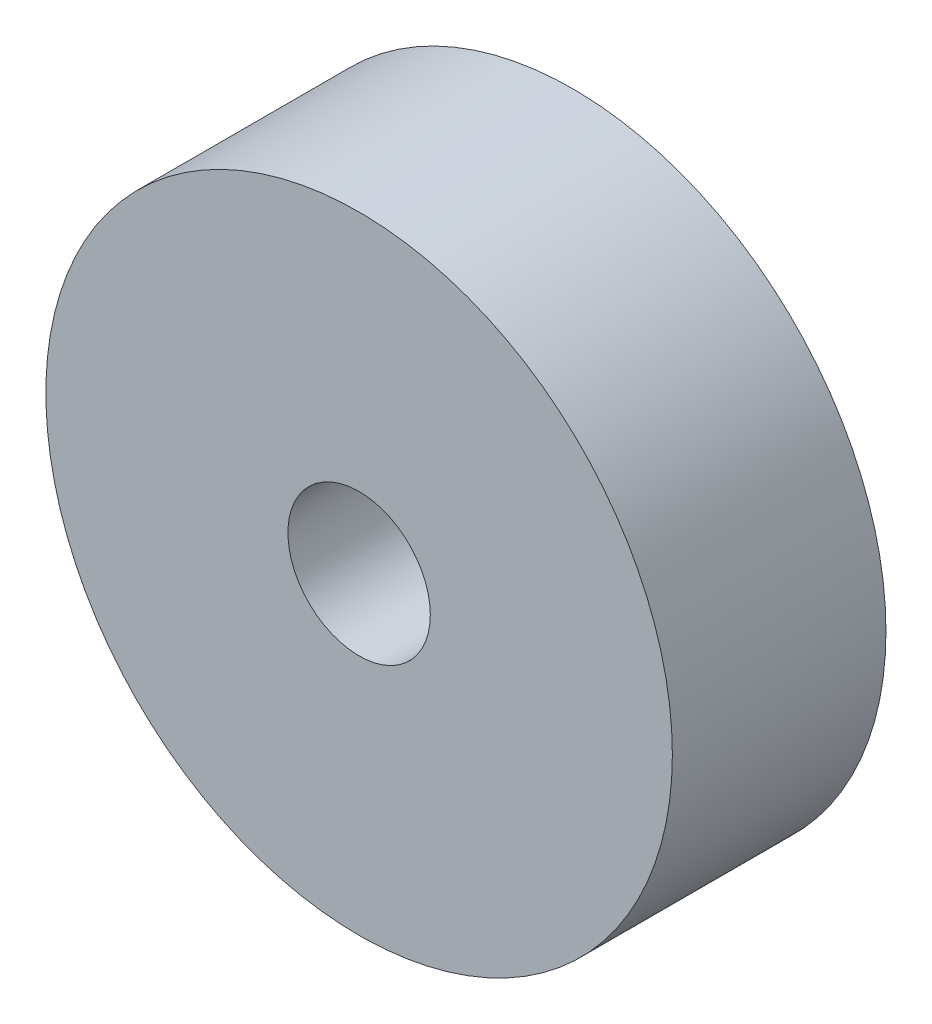
ISO-10303-21;
HEADER;
FILE_DESCRIPTION(('STEP AP214'),'2;1');
FILE_NAME('part.step','',(''),(''),'','','');
FILE_SCHEMA(('AUTOMOTIVE_DESIGN { 1 0 10303 214 1 1 1 1 }'));
ENDSEC;
DATA;
#1=APPLICATION_CONTEXT('core data for automotive mechanical design processes');
#2=APPLICATION_PROTOCOL_DEFINITION('international standard','automotive_design',2000,#1);
#3=PRODUCT_CONTEXT('',#1,'mechanical');
#4=PRODUCT('Part','Part','',(#3));
#5=PRODUCT_RELATED_PRODUCT_CATEGORY('part','',(#4));
#6=PRODUCT_DEFINITION_FORMATION('','',#4);
#7=PRODUCT_DEFINITION_CONTEXT('part definition',#1,'design');
#8=PRODUCT_DEFINITION('design','',#6,#7);
#9=PRODUCT_DEFINITION_SHAPE('','',#8);
#10=(LENGTH_UNIT() NAMED_UNIT(*) SI_UNIT(.MILLI.,.METRE.));
#11=(NAMED_UNIT(*) PLANE_ANGLE_UNIT() SI_UNIT($,.RADIAN.));
#12=(NAMED_UNIT(*) SI_UNIT($,.STERADIAN.) SOLID_ANGLE_UNIT());
#13=UNCERTAINTY_MEASURE_WITH_UNIT(LENGTH_MEASURE(1.E-05),#10,'distance_accuracy_value','');
#14=(GEOMETRIC_REPRESENTATION_CONTEXT(3) GLOBAL_UNCERTAINTY_ASSIGNED_CONTEXT((#13)) GLOBAL_UNIT_ASSIGNED_CONTEXT((#10,
#11,#12)) REPRESENTATION_CONTEXT('',''));
#15=CARTESIAN_POINT('',(0.,0.,0.));
#16=DIRECTION('',(0.,0.,1.));
#17=DIRECTION('',(1.,0.,0.));
#18=AXIS2_PLACEMENT_3D('',#15,#16,#17);
#19=CARTESIAN_POINT('',(0.,0.,15.));
#20=DIRECTION('',(0.,0.,1.));
#21=DIRECTION('',(1.,0.,0.));
#22=AXIS2_PLACEMENT_3D('',#19,#20,#21);
#23=PLANE('',#22);
#24=CARTESIAN_POINT('',(0.,0.,15.));
#25=DIRECTION('',(0.,0.,1.));
#26=DIRECTION('',(1.,0.,0.));
#27=AXIS2_PLACEMENT_3D('',#24,#25,#26);
#28=CIRCLE('',#27,5.);
#29=CARTESIAN_POINT('',(5.,0.,15.));
#30=VERTEX_POINT('',#29);
#31=EDGE_CURVE('E10',#30,#30,#28,.T.);
#32=ORIENTED_EDGE('',*,*,#31,.F.);
#33=EDGE_LOOP('',(#32));
#34=FACE_BOUND('',#33,.T.);
#35=CARTESIAN_POINT('',(0.,0.,15.));
#36=DIRECTION('',(0.,0.,1.));
#37=DIRECTION('',(1.,0.,0.));
#38=AXIS2_PLACEMENT_3D('',#35,#36,#37);
#39=CIRCLE('',#38,22.);
#40=CARTESIAN_POINT('',(22.,0.,15.));
#41=VERTEX_POINT('',#40);
#42=EDGE_CURVE('E41',#41,#41,#39,.T.);
#43=ORIENTED_EDGE('',*,*,#42,.T.);
#44=EDGE_LOOP('',(#43));
#45=FACE_BOUND('',#44,.T.);
#46=ADVANCED_FACE('F16',(#34,#45),#23,.T.);
#47=CARTESIAN_POINT('',(0.,0.,0.));
#48=DIRECTION('',(0.,0.,-1.));
#49=DIRECTION('',(1.,0.,0.));
#50=AXIS2_PLACEMENT_3D('',#47,#48,#49);
#51=CYLINDRICAL_SURFACE('',#50,5.);
#52=CARTESIAN_POINT('',(0.,0.,0.));
#53=DIRECTION('',(0.,0.,1.));
#54=DIRECTION('',(1.,0.,0.));
#55=AXIS2_PLACEMENT_3D('',#52,#53,#54);
#56=CIRCLE('',#55,5.);
#57=CARTESIAN_POINT('',(5.,0.,0.));
#58=VERTEX_POINT('',#57);
#59=EDGE_CURVE('E57',#58,#58,#56,.T.);
#60=ORIENTED_EDGE('',*,*,#59,.F.);
#61=DIRECTION('',(0.,0.,1.));
#62=VECTOR('',#61,1.);
#63=CARTESIAN_POINT('',(5.,0.,0.));
#64=LINE('',#63,#62);
#65=EDGE_CURVE('E24',#58,#30,#64,.T.);
#66=ORIENTED_EDGE('',*,*,#65,.T.);
#67=ORIENTED_EDGE('',*,*,#31,.T.);
#68=ORIENTED_EDGE('',*,*,#65,.F.);
#69=EDGE_LOOP('',(#60,#66,#67,#68));
#70=FACE_BOUND('',#69,.T.);
#71=ADVANCED_FACE('F70',(#70),#51,.F.);
#72=CARTESIAN_POINT('',(0.,0.,0.));
#73=DIRECTION('',(0.,0.,1.));
#74=DIRECTION('',(1.,0.,0.));
#75=AXIS2_PLACEMENT_3D('',#72,#73,#74);
#76=CYLINDRICAL_SURFACE('',#75,22.);
#77=CARTESIAN_POINT('',(0.,0.,0.));
#78=DIRECTION('',(0.,0.,1.));
#79=DIRECTION('',(1.,0.,0.));
#80=AXIS2_PLACEMENT_3D('',#77,#78,#79);
#81=CIRCLE('',#80,22.);
#82=CARTESIAN_POINT('',(22.,0.,0.));
#83=VERTEX_POINT('',#82);
#84=EDGE_CURVE('E55',#83,#83,#81,.T.);
#85=ORIENTED_EDGE('',*,*,#84,.T.);
#86=DIRECTION('',(0.,0.,1.));
#87=VECTOR('',#86,1.);
#88=CARTESIAN_POINT('',(22.,0.,0.));
#89=LINE('',#88,#87);
#90=EDGE_CURVE('E52',#83,#41,#89,.T.);
#91=ORIENTED_EDGE('',*,*,#90,.T.);
#92=ORIENTED_EDGE('',*,*,#42,.F.);
#93=ORIENTED_EDGE('',*,*,#90,.F.);
#94=EDGE_LOOP('',(#85,#91,#92,#93));
#95=FACE_BOUND('',#94,.T.);
#96=ADVANCED_FACE('F53',(#95),#76,.T.);
#97=CARTESIAN_POINT('',(0.,0.,0.));
#98=DIRECTION('',(0.,0.,1.));
#99=DIRECTION('',(1.,0.,0.));
#100=AXIS2_PLACEMENT_3D('',#97,#98,#99);
#101=PLANE('',#100);
#102=ORIENTED_EDGE('',*,*,#59,.T.);
#103=EDGE_LOOP('',(#102));
#104=FACE_BOUND('',#103,.T.);
#105=ORIENTED_EDGE('',*,*,#84,.F.);
#106=EDGE_LOOP('',(#105));
#107=FACE_BOUND('',#106,.T.);
#108=ADVANCED_FACE('F72',(#104,#107),#101,.F.);
#109=CLOSED_SHELL('',(#46,#71,#96,#108));
#110=MANIFOLD_SOLID_BREP('B1',#109);
#111=ADVANCED_BREP_SHAPE_REPRESENTATION('',(#18,#110),#14);
#112=SHAPE_DEFINITION_REPRESENTATION(#9,#111);
ENDSEC;
END-ISO-10303-21;
